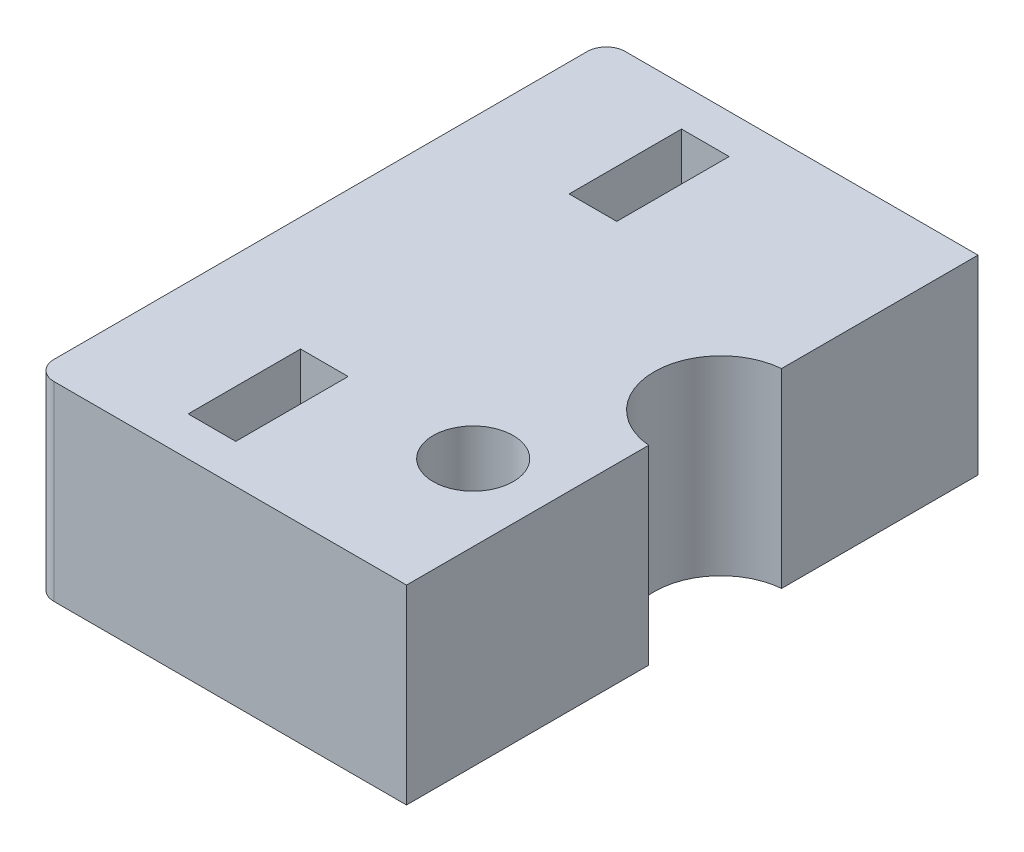
ISO-10303-21;
HEADER;
FILE_DESCRIPTION(('STEP AP214'),'2;1');
FILE_NAME('part.step','',(''),(''),'','','');
FILE_SCHEMA(('AUTOMOTIVE_DESIGN { 1 0 10303 214 1 1 1 1 }'));
ENDSEC;
DATA;
#1=APPLICATION_CONTEXT('core data for automotive mechanical design processes');
#2=APPLICATION_PROTOCOL_DEFINITION('international standard','automotive_design',2000,#1);
#3=PRODUCT_CONTEXT('',#1,'mechanical');
#4=PRODUCT('Part','Part','',(#3));
#5=PRODUCT_RELATED_PRODUCT_CATEGORY('part','',(#4));
#6=PRODUCT_DEFINITION_FORMATION('','',#4);
#7=PRODUCT_DEFINITION_CONTEXT('part definition',#1,'design');
#8=PRODUCT_DEFINITION('design','',#6,#7);
#9=PRODUCT_DEFINITION_SHAPE('','',#8);
#10=(LENGTH_UNIT() NAMED_UNIT(*) SI_UNIT(.MILLI.,.METRE.));
#11=(NAMED_UNIT(*) PLANE_ANGLE_UNIT() SI_UNIT($,.RADIAN.));
#12=(NAMED_UNIT(*) SI_UNIT($,.STERADIAN.) SOLID_ANGLE_UNIT());
#13=UNCERTAINTY_MEASURE_WITH_UNIT(LENGTH_MEASURE(1.E-05),#10,'distance_accuracy_value','');
#14=(GEOMETRIC_REPRESENTATION_CONTEXT(3) GLOBAL_UNCERTAINTY_ASSIGNED_CONTEXT((#13)) GLOBAL_UNIT_ASSIGNED_CONTEXT((#10,
#11,#12)) REPRESENTATION_CONTEXT('',''));
#15=CARTESIAN_POINT('',(0.,0.,0.));
#16=DIRECTION('',(0.,0.,1.));
#17=DIRECTION('',(1.,0.,0.));
#18=AXIS2_PLACEMENT_3D('',#15,#16,#17);
#19=CARTESIAN_POINT('',(-17.5136,5.,10.));
#20=DIRECTION('',(-1.,0.,0.));
#21=DIRECTION('',(0.,0.,1.));
#22=AXIS2_PLACEMENT_3D('',#19,#20,#21);
#23=CYLINDRICAL_SURFACE('',#22,1.7);
#24=CARTESIAN_POINT('',(-29.5136,5.,10.));
#25=DIRECTION('',(-1.,0.,0.));
#26=DIRECTION('',(0.,0.,1.));
#27=AXIS2_PLACEMENT_3D('',#24,#25,#26);
#28=CIRCLE('',#27,1.7);
#29=CARTESIAN_POINT('',(-29.5136,5.,11.7));
#30=VERTEX_POINT('',#29);
#31=EDGE_CURVE('E200',#30,#30,#28,.T.);
#32=ORIENTED_EDGE('',*,*,#31,.T.);
#33=EDGE_LOOP('',(#32));
#34=FACE_BOUND('',#33,.T.);
#35=CARTESIAN_POINT('',(-23.5136,5.,10.));
#36=DIRECTION('',(1.,0.,0.));
#37=DIRECTION('',(0.,0.,-1.));
#38=AXIS2_PLACEMENT_3D('',#35,#36,#37);
#39=CIRCLE('',#38,1.7);
#40=CARTESIAN_POINT('',(-23.5136,5.,8.3));
#41=VERTEX_POINT('',#40);
#42=EDGE_CURVE('E201',#41,#41,#39,.F.);
#43=ORIENTED_EDGE('',*,*,#42,.F.);
#44=EDGE_LOOP('',(#43));
#45=FACE_BOUND('',#44,.T.);
#46=ADVANCED_FACE('F33',(#34,#45),#23,.F.);
#47=CARTESIAN_POINT('',(0.,10.,0.));
#48=DIRECTION('',(0.,-1.,0.));
#49=DIRECTION('',(0.,0.,-1.));
#50=AXIS2_PLACEMENT_3D('',#47,#48,#49);
#51=PLANE('',#50);
#52=DIRECTION('',(1.,0.,0.));
#53=VECTOR('',#52,1.);
#54=CARTESIAN_POINT('',(-29.5136,10.,15.));
#55=LINE('',#54,#53);
#56=CARTESIAN_POINT('',(-28.5136,10.,15.));
#57=VERTEX_POINT('',#56);
#58=CARTESIAN_POINT('',(-10.,10.,15.));
#59=VERTEX_POINT('',#58);
#60=EDGE_CURVE('E188',#57,#59,#55,.T.);
#61=ORIENTED_EDGE('',*,*,#60,.T.);
#62=DIRECTION('',(0.,0.,1.));
#63=VECTOR('',#62,1.);
#64=CARTESIAN_POINT('',(-10.,10.,-15.));
#65=LINE('',#64,#63);
#66=CARTESIAN_POINT('',(-10.,10.,2.28711915483254));
#67=VERTEX_POINT('',#66);
#68=EDGE_CURVE('E236',#67,#59,#65,.T.);
#69=ORIENTED_EDGE('',*,*,#68,.F.);
#70=CARTESIAN_POINT('',(-9.7,10.,-1.2));
#71=DIRECTION('',(0.,1.,0.));
#72=DIRECTION('',(0.,0.,1.));
#73=AXIS2_PLACEMENT_3D('',#70,#71,#72);
#74=CIRCLE('',#73,3.5);
#75=CARTESIAN_POINT('',(-10.,10.,-4.68711915483253));
#76=VERTEX_POINT('',#75);
#77=EDGE_CURVE('E229',#76,#67,#74,.T.);
#78=ORIENTED_EDGE('',*,*,#77,.F.);
#79=CARTESIAN_POINT('',(-10.,10.,-15.));
#80=VERTEX_POINT('',#79);
#81=EDGE_CURVE('E48',#80,#76,#65,.T.);
#82=ORIENTED_EDGE('',*,*,#81,.F.);
#83=DIRECTION('',(-1.,0.,0.));
#84=VECTOR('',#83,1.);
#85=CARTESIAN_POINT('',(-29.5136,10.,-15.));
#86=LINE('',#85,#84);
#87=CARTESIAN_POINT('',(-28.5136,10.,-15.));
#88=VERTEX_POINT('',#87);
#89=EDGE_CURVE('E170',#80,#88,#86,.T.);
#90=ORIENTED_EDGE('',*,*,#89,.T.);
#91=CARTESIAN_POINT('',(-28.5136,10.,-14.));
#92=DIRECTION('',(0.,-1.,0.));
#93=DIRECTION('',(0.,0.,-1.));
#94=AXIS2_PLACEMENT_3D('',#91,#92,#93);
#95=CIRCLE('',#94,1.);
#96=CARTESIAN_POINT('',(-29.5136,10.,-14.));
#97=VERTEX_POINT('',#96);
#98=EDGE_CURVE('E220',#88,#97,#95,.F.);
#99=ORIENTED_EDGE('',*,*,#98,.T.);
#100=DIRECTION('',(0.,0.,1.));
#101=VECTOR('',#100,1.);
#102=CARTESIAN_POINT('',(-29.5136,10.,15.));
#103=LINE('',#102,#101);
#104=CARTESIAN_POINT('',(-29.5136,10.,14.));
#105=VERTEX_POINT('',#104);
#106=EDGE_CURVE('E330',#97,#105,#103,.T.);
#107=ORIENTED_EDGE('',*,*,#106,.T.);
#108=CARTESIAN_POINT('',(-28.5136,10.,14.));
#109=DIRECTION('',(0.,-1.,0.));
#110=DIRECTION('',(0.,0.,-1.));
#111=AXIS2_PLACEMENT_3D('',#108,#109,#110);
#112=CIRCLE('',#111,1.);
#113=EDGE_CURVE('E222',#105,#57,#112,.F.);
#114=ORIENTED_EDGE('',*,*,#113,.T.);
#115=EDGE_LOOP('',(#61,#69,#78,#82,#90,#99,#107,#114));
#116=FACE_BOUND('',#115,.T.);
#117=DIRECTION('',(-1.,0.,0.));
#118=VECTOR('',#117,1.);
#119=CARTESIAN_POINT('',(-21.0136,10.,7.05));
#120=LINE('',#119,#118);
#121=CARTESIAN_POINT('',(-21.0136,10.,7.05));
#122=VERTEX_POINT('',#121);
#123=CARTESIAN_POINT('',(-23.5136,10.,7.05));
#124=VERTEX_POINT('',#123);
#125=EDGE_CURVE('E205',#122,#124,#120,.T.);
#126=ORIENTED_EDGE('',*,*,#125,.F.);
#127=DIRECTION('',(0.,0.,-1.));
#128=VECTOR('',#127,1.);
#129=CARTESIAN_POINT('',(-21.0136,10.,7.05));
#130=LINE('',#129,#128);
#131=CARTESIAN_POINT('',(-21.0136,10.,12.95));
#132=VERTEX_POINT('',#131);
#133=EDGE_CURVE('E254',#132,#122,#130,.T.);
#134=ORIENTED_EDGE('',*,*,#133,.F.);
#135=DIRECTION('',(-1.,0.,0.));
#136=VECTOR('',#135,1.);
#137=CARTESIAN_POINT('',(-21.0136,10.,12.95));
#138=LINE('',#137,#136);
#139=CARTESIAN_POINT('',(-23.5136,10.,12.95));
#140=VERTEX_POINT('',#139);
#141=EDGE_CURVE('E271',#132,#140,#138,.T.);
#142=ORIENTED_EDGE('',*,*,#141,.T.);
#143=DIRECTION('',(0.,0.,-1.));
#144=VECTOR('',#143,1.);
#145=CARTESIAN_POINT('',(-23.5136,10.,7.05));
#146=LINE('',#145,#144);
#147=EDGE_CURVE('E246',#140,#124,#146,.T.);
#148=ORIENTED_EDGE('',*,*,#147,.T.);
#149=EDGE_LOOP('',(#126,#134,#142,#148));
#150=FACE_BOUND('',#149,.T.);
#151=CARTESIAN_POINT('',(-14.,10.,7.5));
#152=DIRECTION('',(0.,1.,0.));
#153=DIRECTION('',(0.,0.,1.));
#154=AXIS2_PLACEMENT_3D('',#151,#152,#153);
#155=CIRCLE('',#154,2.1);
#156=CARTESIAN_POINT('',(-14.,10.,9.6));
#157=VERTEX_POINT('',#156);
#158=EDGE_CURVE('E185',#157,#157,#155,.T.);
#159=ORIENTED_EDGE('',*,*,#158,.F.);
#160=EDGE_LOOP('',(#159));
#161=FACE_BOUND('',#160,.T.);
#162=DIRECTION('',(0.,0.,-1.));
#163=VECTOR('',#162,1.);
#164=CARTESIAN_POINT('',(-21.0136,10.,-12.95));
#165=LINE('',#164,#163);
#166=CARTESIAN_POINT('',(-21.0136,10.,-7.05));
#167=VERTEX_POINT('',#166);
#168=CARTESIAN_POINT('',(-21.0136,10.,-12.95));
#169=VERTEX_POINT('',#168);
#170=EDGE_CURVE('E283',#167,#169,#165,.T.);
#171=ORIENTED_EDGE('',*,*,#170,.F.);
#172=DIRECTION('',(-1.,0.,0.));
#173=VECTOR('',#172,1.);
#174=CARTESIAN_POINT('',(-21.0136,10.,-7.05));
#175=LINE('',#174,#173);
#176=CARTESIAN_POINT('',(-23.5136,10.,-7.05));
#177=VERTEX_POINT('',#176);
#178=EDGE_CURVE('E295',#167,#177,#175,.T.);
#179=ORIENTED_EDGE('',*,*,#178,.T.);
#180=DIRECTION('',(0.,0.,-1.));
#181=VECTOR('',#180,1.);
#182=CARTESIAN_POINT('',(-23.5136,10.,-12.95));
#183=LINE('',#182,#181);
#184=CARTESIAN_POINT('',(-23.5136,10.,-12.95));
#185=VERTEX_POINT('',#184);
#186=EDGE_CURVE('E208',#177,#185,#183,.T.);
#187=ORIENTED_EDGE('',*,*,#186,.T.);
#188=DIRECTION('',(-1.,0.,0.));
#189=VECTOR('',#188,1.);
#190=CARTESIAN_POINT('',(-21.0136,10.,-12.95));
#191=LINE('',#190,#189);
#192=EDGE_CURVE('E313',#169,#185,#191,.T.);
#193=ORIENTED_EDGE('',*,*,#192,.F.);
#194=EDGE_LOOP('',(#171,#179,#187,#193));
#195=FACE_BOUND('',#194,.T.);
#196=ADVANCED_FACE('F234',(#116,#150,#161,#195),#51,.F.);
#197=CARTESIAN_POINT('',(-29.5136,10.,-15.));
#198=DIRECTION('',(0.,0.,1.));
#199=DIRECTION('',(1.,0.,0.));
#200=AXIS2_PLACEMENT_3D('',#197,#198,#199);
#201=PLANE('',#200);
#202=ORIENTED_EDGE('',*,*,#89,.F.);
#203=DIRECTION('',(0.,1.,0.));
#204=VECTOR('',#203,1.);
#205=CARTESIAN_POINT('',(-10.,0.,-15.));
#206=LINE('',#205,#204);
#207=CARTESIAN_POINT('',(-10.,0.,-15.));
#208=VERTEX_POINT('',#207);
#209=EDGE_CURVE('E158',#208,#80,#206,.T.);
#210=ORIENTED_EDGE('',*,*,#209,.F.);
#211=DIRECTION('',(-1.,0.,0.));
#212=VECTOR('',#211,1.);
#213=CARTESIAN_POINT('',(-29.5136,0.,-15.));
#214=LINE('',#213,#212);
#215=CARTESIAN_POINT('',(-28.5136,0.,-15.));
#216=VERTEX_POINT('',#215);
#217=EDGE_CURVE('E168',#208,#216,#214,.T.);
#218=ORIENTED_EDGE('',*,*,#217,.T.);
#219=DIRECTION('',(0.,-1.,0.));
#220=VECTOR('',#219,1.);
#221=CARTESIAN_POINT('',(-28.5136,10.,-15.));
#222=LINE('',#221,#220);
#223=EDGE_CURVE('E224',#216,#88,#222,.F.);
#224=ORIENTED_EDGE('',*,*,#223,.T.);
#225=EDGE_LOOP('',(#202,#210,#218,#224));
#226=FACE_BOUND('',#225,.T.);
#227=ADVANCED_FACE('F166',(#226),#201,.F.);
#228=CARTESIAN_POINT('',(-29.5136,10.,15.));
#229=DIRECTION('',(1.,0.,0.));
#230=DIRECTION('',(0.,0.,-1.));
#231=AXIS2_PLACEMENT_3D('',#228,#229,#230);
#232=PLANE('',#231);
#233=ORIENTED_EDGE('',*,*,#31,.F.);
#234=EDGE_LOOP('',(#233));
#235=FACE_BOUND('',#234,.T.);
#236=CARTESIAN_POINT('',(-29.5136,5.,-10.));
#237=DIRECTION('',(-1.,0.,0.));
#238=DIRECTION('',(0.,0.,1.));
#239=AXIS2_PLACEMENT_3D('',#236,#237,#238);
#240=CIRCLE('',#239,1.7);
#241=CARTESIAN_POINT('',(-29.5136,5.,-8.3));
#242=VERTEX_POINT('',#241);
#243=EDGE_CURVE('E320',#242,#242,#240,.T.);
#244=ORIENTED_EDGE('',*,*,#243,.F.);
#245=EDGE_LOOP('',(#244));
#246=FACE_BOUND('',#245,.T.);
#247=DIRECTION('',(0.,0.,1.));
#248=VECTOR('',#247,1.);
#249=CARTESIAN_POINT('',(-29.5136,0.,15.));
#250=LINE('',#249,#248);
#251=CARTESIAN_POINT('',(-29.5136,0.,-14.));
#252=VERTEX_POINT('',#251);
#253=CARTESIAN_POINT('',(-29.5136,0.,14.));
#254=VERTEX_POINT('',#253);
#255=EDGE_CURVE('E178',#252,#254,#250,.T.);
#256=ORIENTED_EDGE('',*,*,#255,.T.);
#257=DIRECTION('',(0.,-1.,0.));
#258=VECTOR('',#257,1.);
#259=CARTESIAN_POINT('',(-29.5136,10.,14.));
#260=LINE('',#259,#258);
#261=EDGE_CURVE('E218',#254,#105,#260,.F.);
#262=ORIENTED_EDGE('',*,*,#261,.T.);
#263=ORIENTED_EDGE('',*,*,#106,.F.);
#264=DIRECTION('',(0.,-1.,0.));
#265=VECTOR('',#264,1.);
#266=CARTESIAN_POINT('',(-29.5136,10.,-14.));
#267=LINE('',#266,#265);
#268=EDGE_CURVE('E215',#97,#252,#267,.T.);
#269=ORIENTED_EDGE('',*,*,#268,.T.);
#270=EDGE_LOOP('',(#256,#262,#263,#269));
#271=FACE_BOUND('',#270,.T.);
#272=ADVANCED_FACE('F343',(#235,#246,#271),#232,.F.);
#273=CARTESIAN_POINT('',(-29.5136,10.,15.));
#274=DIRECTION('',(0.,0.,-1.));
#275=DIRECTION('',(-1.,0.,0.));
#276=AXIS2_PLACEMENT_3D('',#273,#274,#275);
#277=PLANE('',#276);
#278=DIRECTION('',(1.,0.,0.));
#279=VECTOR('',#278,1.);
#280=CARTESIAN_POINT('',(-29.5136,0.,15.));
#281=LINE('',#280,#279);
#282=CARTESIAN_POINT('',(-28.5136,0.,15.));
#283=VERTEX_POINT('',#282);
#284=CARTESIAN_POINT('',(-10.,0.,15.));
#285=VERTEX_POINT('',#284);
#286=EDGE_CURVE('E182',#283,#285,#281,.T.);
#287=ORIENTED_EDGE('',*,*,#286,.T.);
#288=DIRECTION('',(0.,1.,0.));
#289=VECTOR('',#288,1.);
#290=CARTESIAN_POINT('',(-10.,0.,15.));
#291=LINE('',#290,#289);
#292=EDGE_CURVE('E171',#285,#59,#291,.T.);
#293=ORIENTED_EDGE('',*,*,#292,.T.);
#294=ORIENTED_EDGE('',*,*,#60,.F.);
#295=DIRECTION('',(0.,-1.,0.));
#296=VECTOR('',#295,1.);
#297=CARTESIAN_POINT('',(-28.5136,10.,15.));
#298=LINE('',#297,#296);
#299=EDGE_CURVE('E209',#57,#283,#298,.T.);
#300=ORIENTED_EDGE('',*,*,#299,.T.);
#301=EDGE_LOOP('',(#287,#293,#294,#300));
#302=FACE_BOUND('',#301,.T.);
#303=ADVANCED_FACE('F337',(#302),#277,.F.);
#304=CARTESIAN_POINT('',(0.,0.,0.));
#305=DIRECTION('',(0.,-1.,0.));
#306=DIRECTION('',(0.,0.,-1.));
#307=AXIS2_PLACEMENT_3D('',#304,#305,#306);
#308=PLANE('',#307);
#309=DIRECTION('',(0.,0.,1.));
#310=VECTOR('',#309,1.);
#311=CARTESIAN_POINT('',(-10.,0.,-15.));
#312=LINE('',#311,#310);
#313=CARTESIAN_POINT('',(-10.,0.,2.28711915483254));
#314=VERTEX_POINT('',#313);
#315=EDGE_CURVE('E56',#314,#285,#312,.T.);
#316=ORIENTED_EDGE('',*,*,#315,.T.);
#317=ORIENTED_EDGE('',*,*,#286,.F.);
#318=CARTESIAN_POINT('',(-28.5136,0.,14.));
#319=DIRECTION('',(0.,-1.,0.));
#320=DIRECTION('',(0.,0.,-1.));
#321=AXIS2_PLACEMENT_3D('',#318,#319,#320);
#322=CIRCLE('',#321,1.);
#323=EDGE_CURVE('E213',#283,#254,#322,.T.);
#324=ORIENTED_EDGE('',*,*,#323,.T.);
#325=ORIENTED_EDGE('',*,*,#255,.F.);
#326=CARTESIAN_POINT('',(-28.5136,0.,-14.));
#327=DIRECTION('',(0.,-1.,0.));
#328=DIRECTION('',(0.,0.,-1.));
#329=AXIS2_PLACEMENT_3D('',#326,#327,#328);
#330=CIRCLE('',#329,1.);
#331=EDGE_CURVE('E176',#252,#216,#330,.T.);
#332=ORIENTED_EDGE('',*,*,#331,.T.);
#333=ORIENTED_EDGE('',*,*,#217,.F.);
#334=CARTESIAN_POINT('',(-10.,0.,-4.68711915483253));
#335=VERTEX_POINT('',#334);
#336=EDGE_CURVE('E155',#208,#335,#312,.T.);
#337=ORIENTED_EDGE('',*,*,#336,.T.);
#338=CARTESIAN_POINT('',(-9.7,0.,-1.2));
#339=DIRECTION('',(0.,1.,0.));
#340=DIRECTION('',(0.,0.,1.));
#341=AXIS2_PLACEMENT_3D('',#338,#339,#340);
#342=CIRCLE('',#341,3.5);
#343=EDGE_CURVE('E230',#335,#314,#342,.T.);
#344=ORIENTED_EDGE('',*,*,#343,.T.);
#345=EDGE_LOOP('',(#316,#317,#324,#325,#332,#333,#337,#344));
#346=FACE_BOUND('',#345,.T.);
#347=CARTESIAN_POINT('',(-14.,0.,7.5));
#348=DIRECTION('',(0.,1.,0.));
#349=DIRECTION('',(0.,0.,1.));
#350=AXIS2_PLACEMENT_3D('',#347,#348,#349);
#351=CIRCLE('',#350,2.1);
#352=CARTESIAN_POINT('',(-14.,0.,9.6));
#353=VERTEX_POINT('',#352);
#354=EDGE_CURVE('E179',#353,#353,#351,.T.);
#355=ORIENTED_EDGE('',*,*,#354,.T.);
#356=EDGE_LOOP('',(#355));
#357=FACE_BOUND('',#356,.T.);
#358=ADVANCED_FACE('F173',(#346,#357),#308,.T.);
#359=CARTESIAN_POINT('',(-14.,0.,7.5));
#360=DIRECTION('',(0.,1.,0.));
#361=DIRECTION('',(0.,0.,1.));
#362=AXIS2_PLACEMENT_3D('',#359,#360,#361);
#363=CYLINDRICAL_SURFACE('',#362,2.1);
#364=ORIENTED_EDGE('',*,*,#354,.F.);
#365=EDGE_LOOP('',(#364));
#366=FACE_BOUND('',#365,.T.);
#367=ORIENTED_EDGE('',*,*,#158,.T.);
#368=EDGE_LOOP('',(#367));
#369=FACE_BOUND('',#368,.T.);
#370=ADVANCED_FACE('F458',(#366,#369),#363,.F.);
#371=CARTESIAN_POINT('',(-17.5136,5.,-10.));
#372=DIRECTION('',(-1.,0.,0.));
#373=DIRECTION('',(0.,0.,1.));
#374=AXIS2_PLACEMENT_3D('',#371,#372,#373);
#375=CYLINDRICAL_SURFACE('',#374,1.7);
#376=CARTESIAN_POINT('',(-23.5136,5.,-10.));
#377=DIRECTION('',(-1.,0.,0.));
#378=DIRECTION('',(0.,0.,1.));
#379=AXIS2_PLACEMENT_3D('',#376,#377,#378);
#380=CIRCLE('',#379,1.7);
#381=CARTESIAN_POINT('',(-23.5136,5.,-8.3));
#382=VERTEX_POINT('',#381);
#383=EDGE_CURVE('E193',#382,#382,#380,.F.);
#384=ORIENTED_EDGE('',*,*,#383,.T.);
#385=EDGE_LOOP('',(#384));
#386=FACE_BOUND('',#385,.T.);
#387=ORIENTED_EDGE('',*,*,#243,.T.);
#388=EDGE_LOOP('',(#387));
#389=FACE_BOUND('',#388,.T.);
#390=ADVANCED_FACE('F395',(#386,#389),#375,.F.);
#391=CARTESIAN_POINT('',(-21.0136,0.,0.));
#392=DIRECTION('',(-1.,0.,0.));
#393=DIRECTION('',(0.,0.,1.));
#394=AXIS2_PLACEMENT_3D('',#391,#392,#393);
#395=PLANE('',#394);
#396=DIRECTION('',(0.,1.,0.));
#397=VECTOR('',#396,1.);
#398=CARTESIAN_POINT('',(-21.0136,10.,-7.05));
#399=LINE('',#398,#397);
#400=CARTESIAN_POINT('',(-21.0136,3.2968167058906,-7.05));
#401=VERTEX_POINT('',#400);
#402=EDGE_CURVE('E280',#401,#167,#399,.T.);
#403=ORIENTED_EDGE('',*,*,#402,.T.);
#404=ORIENTED_EDGE('',*,*,#170,.T.);
#405=DIRECTION('',(0.,-1.,0.));
#406=VECTOR('',#405,1.);
#407=CARTESIAN_POINT('',(-21.0136,6.70318329410939,-12.95));
#408=LINE('',#407,#406);
#409=CARTESIAN_POINT('',(-21.0136,3.2968167058906,-12.95));
#410=VERTEX_POINT('',#409);
#411=EDGE_CURVE('E287',#169,#410,#408,.T.);
#412=ORIENTED_EDGE('',*,*,#411,.T.);
#413=DIRECTION('',(0.,-0.5,0.866025403784439));
#414=VECTOR('',#413,1.);
#415=CARTESIAN_POINT('',(-21.0136,3.2968167058906,-12.95));
#416=LINE('',#415,#414);
#417=CARTESIAN_POINT('',(-21.0136,1.59363341178121,-10.));
#418=VERTEX_POINT('',#417);
#419=EDGE_CURVE('E289',#410,#418,#416,.T.);
#420=ORIENTED_EDGE('',*,*,#419,.T.);
#421=DIRECTION('',(0.,0.5,0.866025403784439));
#422=VECTOR('',#421,1.);
#423=CARTESIAN_POINT('',(-21.0136,1.59363341178121,-10.));
#424=LINE('',#423,#422);
#425=EDGE_CURVE('E292',#418,#401,#424,.T.);
#426=ORIENTED_EDGE('',*,*,#425,.T.);
#427=EDGE_LOOP('',(#403,#404,#412,#420,#426));
#428=FACE_BOUND('',#427,.T.);
#429=CARTESIAN_POINT('',(-21.0136,5.,-10.));
#430=DIRECTION('',(-1.,0.,0.));
#431=DIRECTION('',(0.,0.,1.));
#432=AXIS2_PLACEMENT_3D('',#429,#430,#431);
#433=CIRCLE('',#432,1.7);
#434=CARTESIAN_POINT('',(-21.0136,5.,-8.3));
#435=VERTEX_POINT('',#434);
#436=EDGE_CURVE('E196',#435,#435,#433,.F.);
#437=ORIENTED_EDGE('',*,*,#436,.T.);
#438=EDGE_LOOP('',(#437));
#439=FACE_BOUND('',#438,.T.);
#440=ADVANCED_FACE('F411',(#428,#439),#395,.T.);
#441=CARTESIAN_POINT('',(-23.5136,0.,0.));
#442=DIRECTION('',(-1.,0.,0.));
#443=DIRECTION('',(0.,0.,1.));
#444=AXIS2_PLACEMENT_3D('',#441,#442,#443);
#445=PLANE('',#444);
#446=DIRECTION('',(0.,1.,0.));
#447=VECTOR('',#446,1.);
#448=CARTESIAN_POINT('',(-23.5136,3.2968167058906,-7.05));
#449=LINE('',#448,#447);
#450=CARTESIAN_POINT('',(-23.5136,3.2968167058906,-7.05));
#451=VERTEX_POINT('',#450);
#452=EDGE_CURVE('E284',#451,#177,#449,.T.);
#453=ORIENTED_EDGE('',*,*,#452,.F.);
#454=DIRECTION('',(0.,0.5,0.866025403784439));
#455=VECTOR('',#454,1.);
#456=CARTESIAN_POINT('',(-23.5136,1.59363341178121,-10.));
#457=LINE('',#456,#455);
#458=CARTESIAN_POINT('',(-23.5136,1.59363341178121,-10.));
#459=VERTEX_POINT('',#458);
#460=EDGE_CURVE('E304',#459,#451,#457,.T.);
#461=ORIENTED_EDGE('',*,*,#460,.F.);
#462=DIRECTION('',(0.,-0.5,0.866025403784439));
#463=VECTOR('',#462,1.);
#464=CARTESIAN_POINT('',(-23.5136,3.2968167058906,-12.95));
#465=LINE('',#464,#463);
#466=CARTESIAN_POINT('',(-23.5136,3.2968167058906,-12.95));
#467=VERTEX_POINT('',#466);
#468=EDGE_CURVE('E301',#467,#459,#465,.T.);
#469=ORIENTED_EDGE('',*,*,#468,.F.);
#470=DIRECTION('',(0.,-1.,0.));
#471=VECTOR('',#470,1.);
#472=CARTESIAN_POINT('',(-23.5136,6.70318329410939,-12.95));
#473=LINE('',#472,#471);
#474=EDGE_CURVE('E298',#185,#467,#473,.T.);
#475=ORIENTED_EDGE('',*,*,#474,.F.);
#476=ORIENTED_EDGE('',*,*,#186,.F.);
#477=EDGE_LOOP('',(#453,#461,#469,#475,#476));
#478=FACE_BOUND('',#477,.T.);
#479=ORIENTED_EDGE('',*,*,#383,.F.);
#480=EDGE_LOOP('',(#479));
#481=FACE_BOUND('',#480,.T.);
#482=ADVANCED_FACE('F414',(#478,#481),#445,.F.);
#483=CARTESIAN_POINT('',(-21.0136,3.2968167058906,-7.05));
#484=DIRECTION('',(0.,0.,1.));
#485=DIRECTION('',(1.,0.,0.));
#486=AXIS2_PLACEMENT_3D('',#483,#484,#485);
#487=PLANE('',#486);
#488=ORIENTED_EDGE('',*,*,#452,.T.);
#489=ORIENTED_EDGE('',*,*,#178,.F.);
#490=ORIENTED_EDGE('',*,*,#402,.F.);
#491=DIRECTION('',(-1.,0.,0.));
#492=VECTOR('',#491,1.);
#493=CARTESIAN_POINT('',(-21.0136,3.2968167058906,-7.05));
#494=LINE('',#493,#492);
#495=EDGE_CURVE('E197',#401,#451,#494,.T.);
#496=ORIENTED_EDGE('',*,*,#495,.T.);
#497=EDGE_LOOP('',(#488,#489,#490,#496));
#498=FACE_BOUND('',#497,.T.);
#499=ADVANCED_FACE('F418',(#498),#487,.F.);
#500=CARTESIAN_POINT('',(-21.0136,1.59363341178121,-10.));
#501=DIRECTION('',(0.,-0.866025403784439,0.5));
#502=DIRECTION('',(0.,-0.5,-0.866025403784439));
#503=AXIS2_PLACEMENT_3D('',#500,#501,#502);
#504=PLANE('',#503);
#505=ORIENTED_EDGE('',*,*,#460,.T.);
#506=ORIENTED_EDGE('',*,*,#495,.F.);
#507=ORIENTED_EDGE('',*,*,#425,.F.);
#508=DIRECTION('',(-1.,0.,0.));
#509=VECTOR('',#508,1.);
#510=CARTESIAN_POINT('',(-21.0136,1.59363341178121,-10.));
#511=LINE('',#510,#509);
#512=EDGE_CURVE('E309',#418,#459,#511,.T.);
#513=ORIENTED_EDGE('',*,*,#512,.T.);
#514=EDGE_LOOP('',(#505,#506,#507,#513));
#515=FACE_BOUND('',#514,.T.);
#516=ADVANCED_FACE('F422',(#515),#504,.F.);
#517=CARTESIAN_POINT('',(-21.0136,3.2968167058906,-12.95));
#518=DIRECTION('',(0.,-0.866025403784439,-0.5));
#519=DIRECTION('',(0.,0.5,-0.866025403784439));
#520=AXIS2_PLACEMENT_3D('',#517,#518,#519);
#521=PLANE('',#520);
#522=ORIENTED_EDGE('',*,*,#468,.T.);
#523=ORIENTED_EDGE('',*,*,#512,.F.);
#524=ORIENTED_EDGE('',*,*,#419,.F.);
#525=DIRECTION('',(-1.,0.,0.));
#526=VECTOR('',#525,1.);
#527=CARTESIAN_POINT('',(-21.0136,3.2968167058906,-12.95));
#528=LINE('',#527,#526);
#529=EDGE_CURVE('E311',#410,#467,#528,.T.);
#530=ORIENTED_EDGE('',*,*,#529,.T.);
#531=EDGE_LOOP('',(#522,#523,#524,#530));
#532=FACE_BOUND('',#531,.T.);
#533=ADVANCED_FACE('F426',(#532),#521,.F.);
#534=CARTESIAN_POINT('',(-21.0136,6.70318329410939,-12.95));
#535=DIRECTION('',(0.,0.,-1.));
#536=DIRECTION('',(-1.,0.,0.));
#537=AXIS2_PLACEMENT_3D('',#534,#535,#536);
#538=PLANE('',#537);
#539=ORIENTED_EDGE('',*,*,#474,.T.);
#540=ORIENTED_EDGE('',*,*,#529,.F.);
#541=ORIENTED_EDGE('',*,*,#411,.F.);
#542=ORIENTED_EDGE('',*,*,#192,.T.);
#543=EDGE_LOOP('',(#539,#540,#541,#542));
#544=FACE_BOUND('',#543,.T.);
#545=ADVANCED_FACE('F430',(#544),#538,.F.);
#546=CARTESIAN_POINT('',(-17.5136,5.,-10.));
#547=DIRECTION('',(-1.,0.,0.));
#548=DIRECTION('',(0.,0.,1.));
#549=AXIS2_PLACEMENT_3D('',#546,#547,#548);
#550=PLANE('',#549);
#551=CARTESIAN_POINT('',(-17.5136,5.,-10.));
#552=DIRECTION('',(-1.,0.,0.));
#553=DIRECTION('',(0.,0.,1.));
#554=AXIS2_PLACEMENT_3D('',#551,#552,#553);
#555=CIRCLE('',#554,1.7);
#556=CARTESIAN_POINT('',(-17.5136,5.,-8.3));
#557=VERTEX_POINT('',#556);
#558=EDGE_CURVE('E323',#557,#557,#555,.T.);
#559=ORIENTED_EDGE('',*,*,#558,.T.);
#560=EDGE_LOOP('',(#559));
#561=FACE_BOUND('',#560,.T.);
#562=ADVANCED_FACE('F392',(#561),#550,.T.);
#563=ORIENTED_EDGE('',*,*,#558,.F.);
#564=EDGE_LOOP('',(#563));
#565=FACE_BOUND('',#564,.T.);
#566=ORIENTED_EDGE('',*,*,#436,.F.);
#567=EDGE_LOOP('',(#566));
#568=FACE_BOUND('',#567,.T.);
#569=ADVANCED_FACE('F382',(#565,#568),#375,.F.);
#570=CARTESIAN_POINT('',(-21.0136,0.,0.));
#571=DIRECTION('',(1.,0.,0.));
#572=DIRECTION('',(0.,0.,-1.));
#573=AXIS2_PLACEMENT_3D('',#570,#571,#572);
#574=PLANE('',#573);
#575=DIRECTION('',(0.,-1.,0.));
#576=VECTOR('',#575,1.);
#577=CARTESIAN_POINT('',(-21.0136,6.7031832941094,7.05));
#578=LINE('',#577,#576);
#579=CARTESIAN_POINT('',(-21.0136,3.29681670589061,7.05));
#580=VERTEX_POINT('',#579);
#581=EDGE_CURVE('E243',#122,#580,#578,.T.);
#582=ORIENTED_EDGE('',*,*,#581,.T.);
#583=DIRECTION('',(0.,-0.5,0.866025403784439));
#584=VECTOR('',#583,1.);
#585=CARTESIAN_POINT('',(-21.0136,3.29681670589061,7.05));
#586=LINE('',#585,#584);
#587=CARTESIAN_POINT('',(-21.0136,1.59363341178121,10.));
#588=VERTEX_POINT('',#587);
#589=EDGE_CURVE('E245',#580,#588,#586,.T.);
#590=ORIENTED_EDGE('',*,*,#589,.T.);
#591=DIRECTION('',(0.,0.5,0.866025403784438));
#592=VECTOR('',#591,1.);
#593=CARTESIAN_POINT('',(-21.0136,1.59363341178121,10.));
#594=LINE('',#593,#592);
#595=CARTESIAN_POINT('',(-21.0136,3.29681670589061,12.95));
#596=VERTEX_POINT('',#595);
#597=EDGE_CURVE('E249',#588,#596,#594,.T.);
#598=ORIENTED_EDGE('',*,*,#597,.T.);
#599=DIRECTION('',(0.,1.,0.));
#600=VECTOR('',#599,1.);
#601=CARTESIAN_POINT('',(-21.0136,3.29681670589061,12.95));
#602=LINE('',#601,#600);
#603=EDGE_CURVE('E252',#596,#132,#602,.T.);
#604=ORIENTED_EDGE('',*,*,#603,.T.);
#605=ORIENTED_EDGE('',*,*,#133,.T.);
#606=EDGE_LOOP('',(#582,#590,#598,#604,#605));
#607=FACE_BOUND('',#606,.T.);
#608=CARTESIAN_POINT('',(-21.0136,5.,10.));
#609=DIRECTION('',(1.,0.,0.));
#610=DIRECTION('',(0.,0.,-1.));
#611=AXIS2_PLACEMENT_3D('',#608,#609,#610);
#612=CIRCLE('',#611,1.7);
#613=CARTESIAN_POINT('',(-21.0136,5.,8.3));
#614=VERTEX_POINT('',#613);
#615=EDGE_CURVE('E204',#614,#614,#612,.F.);
#616=ORIENTED_EDGE('',*,*,#615,.F.);
#617=EDGE_LOOP('',(#616));
#618=FACE_BOUND('',#617,.T.);
#619=ADVANCED_FACE('F379',(#607,#618),#574,.F.);
#620=CARTESIAN_POINT('',(-23.5136,0.,0.));
#621=DIRECTION('',(1.,0.,0.));
#622=DIRECTION('',(0.,0.,-1.));
#623=AXIS2_PLACEMENT_3D('',#620,#621,#622);
#624=PLANE('',#623);
#625=ORIENTED_EDGE('',*,*,#147,.F.);
#626=DIRECTION('',(0.,1.,0.));
#627=VECTOR('',#626,1.);
#628=CARTESIAN_POINT('',(-23.5136,10.,12.95));
#629=LINE('',#628,#627);
#630=CARTESIAN_POINT('',(-23.5136,3.29681670589061,12.95));
#631=VERTEX_POINT('',#630);
#632=EDGE_CURVE('E266',#631,#140,#629,.T.);
#633=ORIENTED_EDGE('',*,*,#632,.F.);
#634=DIRECTION('',(0.,0.5,0.866025403784438));
#635=VECTOR('',#634,1.);
#636=CARTESIAN_POINT('',(-23.5136,1.59363341178121,10.));
#637=LINE('',#636,#635);
#638=CARTESIAN_POINT('',(-23.5136,1.59363341178121,10.));
#639=VERTEX_POINT('',#638);
#640=EDGE_CURVE('E263',#639,#631,#637,.T.);
#641=ORIENTED_EDGE('',*,*,#640,.F.);
#642=DIRECTION('',(0.,-0.5,0.866025403784439));
#643=VECTOR('',#642,1.);
#644=CARTESIAN_POINT('',(-23.5136,3.29681670589061,7.05));
#645=LINE('',#644,#643);
#646=CARTESIAN_POINT('',(-23.5136,3.29681670589061,7.05));
#647=VERTEX_POINT('',#646);
#648=EDGE_CURVE('E260',#647,#639,#645,.T.);
#649=ORIENTED_EDGE('',*,*,#648,.F.);
#650=DIRECTION('',(0.,-1.,0.));
#651=VECTOR('',#650,1.);
#652=CARTESIAN_POINT('',(-23.5136,6.7031832941094,7.05));
#653=LINE('',#652,#651);
#654=EDGE_CURVE('E238',#124,#647,#653,.T.);
#655=ORIENTED_EDGE('',*,*,#654,.F.);
#656=EDGE_LOOP('',(#625,#633,#641,#649,#655));
#657=FACE_BOUND('',#656,.T.);
#658=ORIENTED_EDGE('',*,*,#42,.T.);
#659=EDGE_LOOP('',(#658));
#660=FACE_BOUND('',#659,.T.);
#661=ADVANCED_FACE('F381',(#657,#660),#624,.T.);
#662=CARTESIAN_POINT('',(-21.0136,10.,12.95));
#663=DIRECTION('',(0.,0.,1.));
#664=DIRECTION('',(1.,0.,0.));
#665=AXIS2_PLACEMENT_3D('',#662,#663,#664);
#666=PLANE('',#665);
#667=ORIENTED_EDGE('',*,*,#632,.T.);
#668=ORIENTED_EDGE('',*,*,#141,.F.);
#669=ORIENTED_EDGE('',*,*,#603,.F.);
#670=DIRECTION('',(-1.,0.,0.));
#671=VECTOR('',#670,1.);
#672=CARTESIAN_POINT('',(-21.0136,3.29681670589061,12.95));
#673=LINE('',#672,#671);
#674=EDGE_CURVE('E274',#596,#631,#673,.T.);
#675=ORIENTED_EDGE('',*,*,#674,.T.);
#676=EDGE_LOOP('',(#667,#668,#669,#675));
#677=FACE_BOUND('',#676,.T.);
#678=ADVANCED_FACE('F389',(#677),#666,.F.);
#679=CARTESIAN_POINT('',(-21.0136,1.59363341178121,10.));
#680=DIRECTION('',(0.,-0.866025403784438,0.5));
#681=DIRECTION('',(0.,-0.5,-0.866025403784438));
#682=AXIS2_PLACEMENT_3D('',#679,#680,#681);
#683=PLANE('',#682);
#684=ORIENTED_EDGE('',*,*,#640,.T.);
#685=ORIENTED_EDGE('',*,*,#674,.F.);
#686=ORIENTED_EDGE('',*,*,#597,.F.);
#687=DIRECTION('',(-1.,0.,0.));
#688=VECTOR('',#687,1.);
#689=CARTESIAN_POINT('',(-21.0136,1.59363341178121,10.));
#690=LINE('',#689,#688);
#691=EDGE_CURVE('E277',#588,#639,#690,.T.);
#692=ORIENTED_EDGE('',*,*,#691,.T.);
#693=EDGE_LOOP('',(#684,#685,#686,#692));
#694=FACE_BOUND('',#693,.T.);
#695=ADVANCED_FACE('F399',(#694),#683,.F.);
#696=CARTESIAN_POINT('',(-21.0136,3.29681670589061,7.05));
#697=DIRECTION('',(0.,-0.866025403784439,-0.5));
#698=DIRECTION('',(0.,0.5,-0.866025403784439));
#699=AXIS2_PLACEMENT_3D('',#696,#697,#698);
#700=PLANE('',#699);
#701=ORIENTED_EDGE('',*,*,#648,.T.);
#702=ORIENTED_EDGE('',*,*,#691,.F.);
#703=ORIENTED_EDGE('',*,*,#589,.F.);
#704=DIRECTION('',(-1.,0.,0.));
#705=VECTOR('',#704,1.);
#706=CARTESIAN_POINT('',(-21.0136,3.29681670589061,7.05));
#707=LINE('',#706,#705);
#708=EDGE_CURVE('E257',#580,#647,#707,.T.);
#709=ORIENTED_EDGE('',*,*,#708,.T.);
#710=EDGE_LOOP('',(#701,#702,#703,#709));
#711=FACE_BOUND('',#710,.T.);
#712=ADVANCED_FACE('F403',(#711),#700,.F.);
#713=CARTESIAN_POINT('',(-21.0136,6.7031832941094,7.05));
#714=DIRECTION('',(0.,0.,-1.));
#715=DIRECTION('',(-1.,0.,0.));
#716=AXIS2_PLACEMENT_3D('',#713,#714,#715);
#717=PLANE('',#716);
#718=ORIENTED_EDGE('',*,*,#654,.T.);
#719=ORIENTED_EDGE('',*,*,#708,.F.);
#720=ORIENTED_EDGE('',*,*,#581,.F.);
#721=ORIENTED_EDGE('',*,*,#125,.T.);
#722=EDGE_LOOP('',(#718,#719,#720,#721));
#723=FACE_BOUND('',#722,.T.);
#724=ADVANCED_FACE('F373',(#723),#717,.F.);
#725=CARTESIAN_POINT('',(-17.5136,5.,10.));
#726=DIRECTION('',(-1.,0.,0.));
#727=DIRECTION('',(0.,0.,1.));
#728=AXIS2_PLACEMENT_3D('',#725,#726,#727);
#729=PLANE('',#728);
#730=CARTESIAN_POINT('',(-17.5136,5.,10.));
#731=DIRECTION('',(-1.,0.,0.));
#732=DIRECTION('',(0.,0.,1.));
#733=AXIS2_PLACEMENT_3D('',#730,#731,#732);
#734=CIRCLE('',#733,1.7);
#735=CARTESIAN_POINT('',(-17.5136,5.,11.7));
#736=VERTEX_POINT('',#735);
#737=EDGE_CURVE('E317',#736,#736,#734,.T.);
#738=ORIENTED_EDGE('',*,*,#737,.T.);
#739=EDGE_LOOP('',(#738));
#740=FACE_BOUND('',#739,.T.);
#741=ADVANCED_FACE('F366',(#740),#729,.T.);
#742=ORIENTED_EDGE('',*,*,#615,.T.);
#743=EDGE_LOOP('',(#742));
#744=FACE_BOUND('',#743,.T.);
#745=ORIENTED_EDGE('',*,*,#737,.F.);
#746=EDGE_LOOP('',(#745));
#747=FACE_BOUND('',#746,.T.);
#748=ADVANCED_FACE('F357',(#744,#747),#23,.F.);
#749=CARTESIAN_POINT('',(-9.7,0.,-1.2));
#750=DIRECTION('',(0.,1.,0.));
#751=DIRECTION('',(0.,0.,1.));
#752=AXIS2_PLACEMENT_3D('',#749,#750,#751);
#753=CYLINDRICAL_SURFACE('',#752,3.5);
#754=ORIENTED_EDGE('',*,*,#77,.T.);
#755=DIRECTION('',(0.,1.,0.));
#756=VECTOR('',#755,1.);
#757=CARTESIAN_POINT('',(-10.,0.,2.28711915483254));
#758=LINE('',#757,#756);
#759=EDGE_CURVE('E11',#67,#314,#758,.F.);
#760=ORIENTED_EDGE('',*,*,#759,.T.);
#761=ORIENTED_EDGE('',*,*,#343,.F.);
#762=DIRECTION('',(0.,1.,0.));
#763=VECTOR('',#762,1.);
#764=CARTESIAN_POINT('',(-10.,0.,-4.68711915483253));
#765=LINE('',#764,#763);
#766=EDGE_CURVE('E41',#335,#76,#765,.T.);
#767=ORIENTED_EDGE('',*,*,#766,.T.);
#768=EDGE_LOOP('',(#754,#760,#761,#767));
#769=FACE_BOUND('',#768,.T.);
#770=ADVANCED_FACE('F228',(#769),#753,.F.);
#771=CARTESIAN_POINT('',(-28.5136,10.,14.));
#772=DIRECTION('',(0.,-1.,0.));
#773=DIRECTION('',(0.,0.,-1.));
#774=AXIS2_PLACEMENT_3D('',#771,#772,#773);
#775=CYLINDRICAL_SURFACE('',#774,1.);
#776=ORIENTED_EDGE('',*,*,#113,.F.);
#777=ORIENTED_EDGE('',*,*,#261,.F.);
#778=ORIENTED_EDGE('',*,*,#323,.F.);
#779=ORIENTED_EDGE('',*,*,#299,.F.);
#780=EDGE_LOOP('',(#776,#777,#778,#779));
#781=FACE_BOUND('',#780,.T.);
#782=ADVANCED_FACE('F340',(#781),#775,.T.);
#783=CARTESIAN_POINT('',(-28.5136,10.,-14.));
#784=DIRECTION('',(0.,-1.,0.));
#785=DIRECTION('',(0.,0.,-1.));
#786=AXIS2_PLACEMENT_3D('',#783,#784,#785);
#787=CYLINDRICAL_SURFACE('',#786,1.);
#788=ORIENTED_EDGE('',*,*,#98,.F.);
#789=ORIENTED_EDGE('',*,*,#223,.F.);
#790=ORIENTED_EDGE('',*,*,#331,.F.);
#791=ORIENTED_EDGE('',*,*,#268,.F.);
#792=EDGE_LOOP('',(#788,#789,#790,#791));
#793=FACE_BOUND('',#792,.T.);
#794=ADVANCED_FACE('F35',(#793),#787,.T.);
#795=CARTESIAN_POINT('',(-10.,0.,-15.));
#796=DIRECTION('',(-1.,0.,0.));
#797=DIRECTION('',(0.,0.,1.));
#798=AXIS2_PLACEMENT_3D('',#795,#796,#797);
#799=PLANE('',#798);
#800=ORIENTED_EDGE('',*,*,#336,.F.);
#801=ORIENTED_EDGE('',*,*,#209,.T.);
#802=ORIENTED_EDGE('',*,*,#81,.T.);
#803=ORIENTED_EDGE('',*,*,#766,.F.);
#804=EDGE_LOOP('',(#800,#801,#802,#803));
#805=FACE_BOUND('',#804,.T.);
#806=ADVANCED_FACE('F157',(#805),#799,.F.);
#807=ORIENTED_EDGE('',*,*,#68,.T.);
#808=ORIENTED_EDGE('',*,*,#292,.F.);
#809=ORIENTED_EDGE('',*,*,#315,.F.);
#810=ORIENTED_EDGE('',*,*,#759,.F.);
#811=EDGE_LOOP('',(#807,#808,#809,#810));
#812=FACE_BOUND('',#811,.T.);
#813=ADVANCED_FACE('F352',(#812),#799,.F.);
#814=CLOSED_SHELL('',(#46,#196,#227,#272,#303,#358,#370,#390,#440,#482,#499,#516,#533,#545,#562,
#569,#619,#661,#678,#695,#712,#724,#741,#748,#770,#782,#794,#806,#813));
#815=MANIFOLD_SOLID_BREP('B2',#814);
#816=ADVANCED_BREP_SHAPE_REPRESENTATION('',(#18,#815),#14);
#817=SHAPE_DEFINITION_REPRESENTATION(#9,#816);
ENDSEC;
END-ISO-10303-21;
